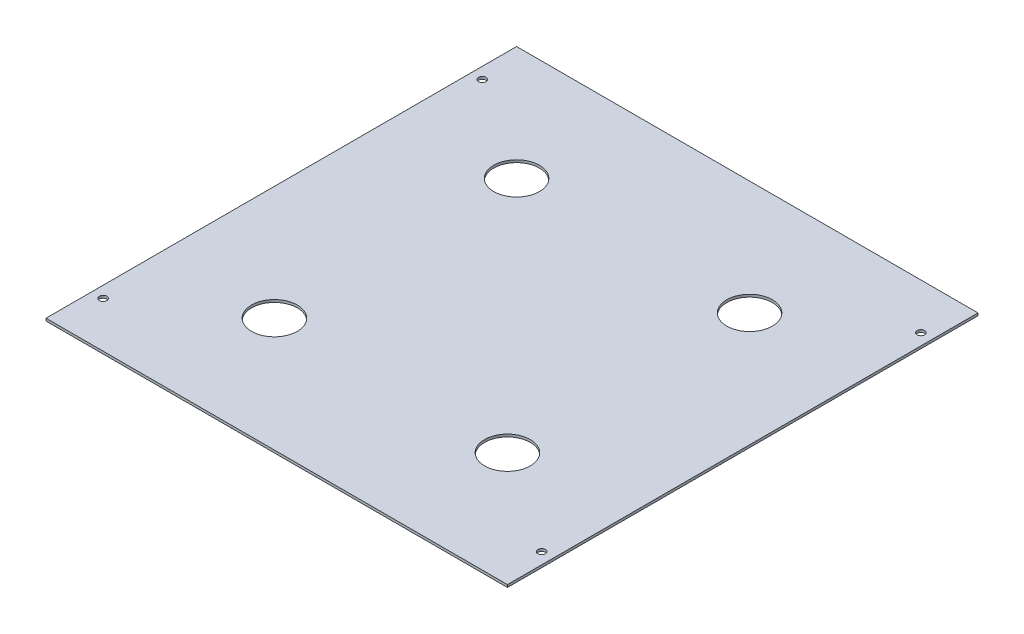
ISO-10303-21;
HEADER;
FILE_DESCRIPTION(('STEP AP214'),'2;1');
FILE_NAME('part.step','',(''),(''),'','','');
FILE_SCHEMA(('AUTOMOTIVE_DESIGN { 1 0 10303 214 1 1 1 1 }'));
ENDSEC;
DATA;
#1=APPLICATION_CONTEXT('core data for automotive mechanical design processes');
#2=APPLICATION_PROTOCOL_DEFINITION('international standard','automotive_design',2000,#1);
#3=PRODUCT_CONTEXT('',#1,'mechanical');
#4=PRODUCT('Part','Part','',(#3));
#5=PRODUCT_RELATED_PRODUCT_CATEGORY('part','',(#4));
#6=PRODUCT_DEFINITION_FORMATION('','',#4);
#7=PRODUCT_DEFINITION_CONTEXT('part definition',#1,'design');
#8=PRODUCT_DEFINITION('design','',#6,#7);
#9=PRODUCT_DEFINITION_SHAPE('','',#8);
#10=(LENGTH_UNIT() NAMED_UNIT(*) SI_UNIT(.MILLI.,.METRE.));
#11=(NAMED_UNIT(*) PLANE_ANGLE_UNIT() SI_UNIT($,.RADIAN.));
#12=(NAMED_UNIT(*) SI_UNIT($,.STERADIAN.) SOLID_ANGLE_UNIT());
#13=UNCERTAINTY_MEASURE_WITH_UNIT(LENGTH_MEASURE(1.E-05),#10,'distance_accuracy_value','');
#14=(GEOMETRIC_REPRESENTATION_CONTEXT(3) GLOBAL_UNCERTAINTY_ASSIGNED_CONTEXT((#13)) GLOBAL_UNIT_ASSIGNED_CONTEXT((#10,
#11,#12)) REPRESENTATION_CONTEXT('',''));
#15=CARTESIAN_POINT('',(0.,0.,0.));
#16=DIRECTION('',(0.,0.,1.));
#17=DIRECTION('',(1.,0.,0.));
#18=AXIS2_PLACEMENT_3D('',#15,#16,#17);
#19=CARTESIAN_POINT('',(0.,1.1,0.));
#20=DIRECTION('',(0.,-1.,0.));
#21=DIRECTION('',(0.,0.,-1.));
#22=AXIS2_PLACEMENT_3D('',#19,#20,#21);
#23=PLANE('',#22);
#24=DIRECTION('',(0.,0.,1.));
#25=VECTOR('',#24,1.);
#26=CARTESIAN_POINT('',(0.,1.1,0.));
#27=LINE('',#26,#25);
#28=CARTESIAN_POINT('',(0.,1.1,-206.));
#29=VERTEX_POINT('',#28);
#30=CARTESIAN_POINT('',(0.,1.1,0.));
#31=VERTEX_POINT('',#30);
#32=EDGE_CURVE('E106',#29,#31,#27,.T.);
#33=ORIENTED_EDGE('',*,*,#32,.T.);
#34=DIRECTION('',(1.,0.,0.));
#35=VECTOR('',#34,1.);
#36=CARTESIAN_POINT('',(0.,1.1,0.));
#37=LINE('',#36,#35);
#38=CARTESIAN_POINT('',(202.,1.1,0.));
#39=VERTEX_POINT('',#38);
#40=EDGE_CURVE('E100',#31,#39,#37,.T.);
#41=ORIENTED_EDGE('',*,*,#40,.T.);
#42=DIRECTION('',(0.,0.,-1.));
#43=VECTOR('',#42,1.);
#44=CARTESIAN_POINT('',(202.,1.1,0.));
#45=LINE('',#44,#43);
#46=CARTESIAN_POINT('',(202.,1.1,-206.));
#47=VERTEX_POINT('',#46);
#48=EDGE_CURVE('E104',#39,#47,#45,.T.);
#49=ORIENTED_EDGE('',*,*,#48,.T.);
#50=DIRECTION('',(-1.,0.,0.));
#51=VECTOR('',#50,1.);
#52=CARTESIAN_POINT('',(0.,1.1,-206.));
#53=LINE('',#52,#51);
#54=EDGE_CURVE('E68',#47,#29,#53,.T.);
#55=ORIENTED_EDGE('',*,*,#54,.T.);
#56=EDGE_LOOP('',(#33,#41,#49,#55));
#57=FACE_BOUND('',#56,.T.);
#58=CARTESIAN_POINT('',(5.,1.1,-186.));
#59=DIRECTION('',(0.,1.,0.));
#60=DIRECTION('',(0.,0.,1.));
#61=AXIS2_PLACEMENT_3D('',#58,#59,#60);
#62=CIRCLE('',#61,1.65000000000001);
#63=CARTESIAN_POINT('',(5.,1.1,-184.35));
#64=VERTEX_POINT('',#63);
#65=EDGE_CURVE('E128',#64,#64,#62,.T.);
#66=ORIENTED_EDGE('',*,*,#65,.F.);
#67=EDGE_LOOP('',(#66));
#68=FACE_BOUND('',#67,.T.);
#69=CARTESIAN_POINT('',(50.,1.1,-156.));
#70=DIRECTION('',(0.,1.,0.));
#71=DIRECTION('',(0.,0.,1.));
#72=AXIS2_PLACEMENT_3D('',#69,#70,#71);
#73=CIRCLE('',#72,10.);
#74=CARTESIAN_POINT('',(50.,1.1,-146.));
#75=VERTEX_POINT('',#74);
#76=EDGE_CURVE('E148',#75,#75,#73,.T.);
#77=ORIENTED_EDGE('',*,*,#76,.F.);
#78=EDGE_LOOP('',(#77));
#79=FACE_BOUND('',#78,.T.);
#80=CARTESIAN_POINT('',(152.,1.1,-156.));
#81=DIRECTION('',(0.,1.,0.));
#82=DIRECTION('',(0.,0.,1.));
#83=AXIS2_PLACEMENT_3D('',#80,#81,#82);
#84=CIRCLE('',#83,10.);
#85=CARTESIAN_POINT('',(152.,1.1,-146.));
#86=VERTEX_POINT('',#85);
#87=EDGE_CURVE('E156',#86,#86,#84,.T.);
#88=ORIENTED_EDGE('',*,*,#87,.F.);
#89=EDGE_LOOP('',(#88));
#90=FACE_BOUND('',#89,.T.);
#91=CARTESIAN_POINT('',(50.,1.1,-50.));
#92=DIRECTION('',(0.,1.,0.));
#93=DIRECTION('',(0.,0.,1.));
#94=AXIS2_PLACEMENT_3D('',#91,#92,#93);
#95=CIRCLE('',#94,10.);
#96=CARTESIAN_POINT('',(50.,1.1,-40.));
#97=VERTEX_POINT('',#96);
#98=EDGE_CURVE('E164',#97,#97,#95,.T.);
#99=ORIENTED_EDGE('',*,*,#98,.F.);
#100=EDGE_LOOP('',(#99));
#101=FACE_BOUND('',#100,.T.);
#102=CARTESIAN_POINT('',(152.,1.1,-50.));
#103=DIRECTION('',(0.,1.,0.));
#104=DIRECTION('',(0.,0.,1.));
#105=AXIS2_PLACEMENT_3D('',#102,#103,#104);
#106=CIRCLE('',#105,10.);
#107=CARTESIAN_POINT('',(152.,1.1,-40.));
#108=VERTEX_POINT('',#107);
#109=EDGE_CURVE('E172',#108,#108,#106,.T.);
#110=ORIENTED_EDGE('',*,*,#109,.F.);
#111=EDGE_LOOP('',(#110));
#112=FACE_BOUND('',#111,.T.);
#113=CARTESIAN_POINT('',(5.,1.1,-20.));
#114=DIRECTION('',(0.,1.,0.));
#115=DIRECTION('',(0.,0.,1.));
#116=AXIS2_PLACEMENT_3D('',#113,#114,#115);
#117=CIRCLE('',#116,1.65);
#118=CARTESIAN_POINT('',(5.,1.1,-18.35));
#119=VERTEX_POINT('',#118);
#120=EDGE_CURVE('E180',#119,#119,#117,.T.);
#121=ORIENTED_EDGE('',*,*,#120,.F.);
#122=EDGE_LOOP('',(#121));
#123=FACE_BOUND('',#122,.T.);
#124=CARTESIAN_POINT('',(197.,1.1,-20.));
#125=DIRECTION('',(0.,1.,0.));
#126=DIRECTION('',(0.,0.,1.));
#127=AXIS2_PLACEMENT_3D('',#124,#125,#126);
#128=CIRCLE('',#127,1.65000000000002);
#129=CARTESIAN_POINT('',(197.,1.1,-18.35));
#130=VERTEX_POINT('',#129);
#131=EDGE_CURVE('E188',#130,#130,#128,.T.);
#132=ORIENTED_EDGE('',*,*,#131,.F.);
#133=EDGE_LOOP('',(#132));
#134=FACE_BOUND('',#133,.T.);
#135=CARTESIAN_POINT('',(197.,1.1,-186.));
#136=DIRECTION('',(0.,1.,0.));
#137=DIRECTION('',(0.,0.,1.));
#138=AXIS2_PLACEMENT_3D('',#135,#136,#137);
#139=CIRCLE('',#138,1.65000000000002);
#140=CARTESIAN_POINT('',(197.,1.1,-184.35));
#141=VERTEX_POINT('',#140);
#142=EDGE_CURVE('E196',#141,#141,#139,.T.);
#143=ORIENTED_EDGE('',*,*,#142,.F.);
#144=EDGE_LOOP('',(#143));
#145=FACE_BOUND('',#144,.T.);
#146=ADVANCED_FACE('F47',(#57,#68,#79,#90,#101,#112,#123,#134,#145),#23,.F.);
#147=CARTESIAN_POINT('',(0.,0.,0.));
#148=DIRECTION('',(0.,-1.,0.));
#149=DIRECTION('',(0.,0.,-1.));
#150=AXIS2_PLACEMENT_3D('',#147,#148,#149);
#151=PLANE('',#150);
#152=CARTESIAN_POINT('',(197.,0.,-20.));
#153=DIRECTION('',(0.,1.,0.));
#154=DIRECTION('',(0.,0.,1.));
#155=AXIS2_PLACEMENT_3D('',#152,#153,#154);
#156=CIRCLE('',#155,1.65000000000002);
#157=CARTESIAN_POINT('',(197.,0.,-18.35));
#158=VERTEX_POINT('',#157);
#159=EDGE_CURVE('E192',#158,#158,#156,.T.);
#160=ORIENTED_EDGE('',*,*,#159,.T.);
#161=EDGE_LOOP('',(#160));
#162=FACE_BOUND('',#161,.T.);
#163=CARTESIAN_POINT('',(152.,0.,-50.));
#164=DIRECTION('',(0.,1.,0.));
#165=DIRECTION('',(0.,0.,1.));
#166=AXIS2_PLACEMENT_3D('',#163,#164,#165);
#167=CIRCLE('',#166,10.);
#168=CARTESIAN_POINT('',(152.,0.,-40.));
#169=VERTEX_POINT('',#168);
#170=EDGE_CURVE('E176',#169,#169,#167,.T.);
#171=ORIENTED_EDGE('',*,*,#170,.T.);
#172=EDGE_LOOP('',(#171));
#173=FACE_BOUND('',#172,.T.);
#174=CARTESIAN_POINT('',(152.,0.,-156.));
#175=DIRECTION('',(0.,1.,0.));
#176=DIRECTION('',(0.,0.,1.));
#177=AXIS2_PLACEMENT_3D('',#174,#175,#176);
#178=CIRCLE('',#177,10.);
#179=CARTESIAN_POINT('',(152.,0.,-146.));
#180=VERTEX_POINT('',#179);
#181=EDGE_CURVE('E160',#180,#180,#178,.T.);
#182=ORIENTED_EDGE('',*,*,#181,.T.);
#183=EDGE_LOOP('',(#182));
#184=FACE_BOUND('',#183,.T.);
#185=CARTESIAN_POINT('',(5.,0.,-186.));
#186=DIRECTION('',(0.,1.,0.));
#187=DIRECTION('',(0.,0.,1.));
#188=AXIS2_PLACEMENT_3D('',#185,#186,#187);
#189=CIRCLE('',#188,1.65000000000001);
#190=CARTESIAN_POINT('',(5.,0.,-184.35));
#191=VERTEX_POINT('',#190);
#192=EDGE_CURVE('E145',#191,#191,#189,.T.);
#193=ORIENTED_EDGE('',*,*,#192,.T.);
#194=EDGE_LOOP('',(#193));
#195=FACE_BOUND('',#194,.T.);
#196=DIRECTION('',(0.,0.,1.));
#197=VECTOR('',#196,1.);
#198=CARTESIAN_POINT('',(0.,0.,0.));
#199=LINE('',#198,#197);
#200=CARTESIAN_POINT('',(0.,0.,-206.));
#201=VERTEX_POINT('',#200);
#202=CARTESIAN_POINT('',(0.,0.,0.));
#203=VERTEX_POINT('',#202);
#204=EDGE_CURVE('E124',#201,#203,#199,.T.);
#205=ORIENTED_EDGE('',*,*,#204,.F.);
#206=DIRECTION('',(-1.,0.,0.));
#207=VECTOR('',#206,1.);
#208=CARTESIAN_POINT('',(0.,0.,-206.));
#209=LINE('',#208,#207);
#210=CARTESIAN_POINT('',(202.,0.,-206.));
#211=VERTEX_POINT('',#210);
#212=EDGE_CURVE('E93',#211,#201,#209,.T.);
#213=ORIENTED_EDGE('',*,*,#212,.F.);
#214=DIRECTION('',(0.,0.,-1.));
#215=VECTOR('',#214,1.);
#216=CARTESIAN_POINT('',(202.,0.,0.));
#217=LINE('',#216,#215);
#218=CARTESIAN_POINT('',(202.,0.,0.));
#219=VERTEX_POINT('',#218);
#220=EDGE_CURVE('E87',#219,#211,#217,.T.);
#221=ORIENTED_EDGE('',*,*,#220,.F.);
#222=DIRECTION('',(1.,0.,0.));
#223=VECTOR('',#222,1.);
#224=CARTESIAN_POINT('',(0.,0.,0.));
#225=LINE('',#224,#223);
#226=EDGE_CURVE('E111',#203,#219,#225,.T.);
#227=ORIENTED_EDGE('',*,*,#226,.F.);
#228=EDGE_LOOP('',(#205,#213,#221,#227));
#229=FACE_BOUND('',#228,.T.);
#230=CARTESIAN_POINT('',(50.,0.,-156.));
#231=DIRECTION('',(0.,1.,0.));
#232=DIRECTION('',(0.,0.,1.));
#233=AXIS2_PLACEMENT_3D('',#230,#231,#232);
#234=CIRCLE('',#233,10.);
#235=CARTESIAN_POINT('',(50.,0.,-146.));
#236=VERTEX_POINT('',#235);
#237=EDGE_CURVE('E152',#236,#236,#234,.T.);
#238=ORIENTED_EDGE('',*,*,#237,.T.);
#239=EDGE_LOOP('',(#238));
#240=FACE_BOUND('',#239,.T.);
#241=CARTESIAN_POINT('',(50.,0.,-50.));
#242=DIRECTION('',(0.,1.,0.));
#243=DIRECTION('',(0.,0.,1.));
#244=AXIS2_PLACEMENT_3D('',#241,#242,#243);
#245=CIRCLE('',#244,10.);
#246=CARTESIAN_POINT('',(50.,0.,-40.));
#247=VERTEX_POINT('',#246);
#248=EDGE_CURVE('E168',#247,#247,#245,.T.);
#249=ORIENTED_EDGE('',*,*,#248,.T.);
#250=EDGE_LOOP('',(#249));
#251=FACE_BOUND('',#250,.T.);
#252=CARTESIAN_POINT('',(5.,0.,-20.));
#253=DIRECTION('',(0.,1.,0.));
#254=DIRECTION('',(0.,0.,1.));
#255=AXIS2_PLACEMENT_3D('',#252,#253,#254);
#256=CIRCLE('',#255,1.65);
#257=CARTESIAN_POINT('',(5.,0.,-18.35));
#258=VERTEX_POINT('',#257);
#259=EDGE_CURVE('E184',#258,#258,#256,.T.);
#260=ORIENTED_EDGE('',*,*,#259,.T.);
#261=EDGE_LOOP('',(#260));
#262=FACE_BOUND('',#261,.T.);
#263=CARTESIAN_POINT('',(197.,0.,-186.));
#264=DIRECTION('',(0.,1.,0.));
#265=DIRECTION('',(0.,0.,1.));
#266=AXIS2_PLACEMENT_3D('',#263,#264,#265);
#267=CIRCLE('',#266,1.65000000000002);
#268=CARTESIAN_POINT('',(197.,0.,-184.35));
#269=VERTEX_POINT('',#268);
#270=EDGE_CURVE('E200',#269,#269,#267,.T.);
#271=ORIENTED_EDGE('',*,*,#270,.T.);
#272=EDGE_LOOP('',(#271));
#273=FACE_BOUND('',#272,.T.);
#274=ADVANCED_FACE('F139',(#162,#173,#184,#195,#229,#240,#251,#262,#273),#151,.T.);
#275=CARTESIAN_POINT('',(0.,1.1,0.));
#276=DIRECTION('',(1.,0.,0.));
#277=DIRECTION('',(0.,0.,-1.));
#278=AXIS2_PLACEMENT_3D('',#275,#276,#277);
#279=PLANE('',#278);
#280=ORIENTED_EDGE('',*,*,#204,.T.);
#281=DIRECTION('',(0.,-1.,0.));
#282=VECTOR('',#281,1.);
#283=CARTESIAN_POINT('',(0.,1.1,0.));
#284=LINE('',#283,#282);
#285=EDGE_CURVE('E11',#31,#203,#284,.T.);
#286=ORIENTED_EDGE('',*,*,#285,.F.);
#287=ORIENTED_EDGE('',*,*,#32,.F.);
#288=DIRECTION('',(0.,-1.,0.));
#289=VECTOR('',#288,1.);
#290=CARTESIAN_POINT('',(0.,1.1,-206.));
#291=LINE('',#290,#289);
#292=EDGE_CURVE('E120',#29,#201,#291,.T.);
#293=ORIENTED_EDGE('',*,*,#292,.T.);
#294=EDGE_LOOP('',(#280,#286,#287,#293));
#295=FACE_BOUND('',#294,.T.);
#296=ADVANCED_FACE('F49',(#295),#279,.F.);
#297=CARTESIAN_POINT('',(0.,1.1,0.));
#298=DIRECTION('',(0.,0.,-1.));
#299=DIRECTION('',(-1.,0.,0.));
#300=AXIS2_PLACEMENT_3D('',#297,#298,#299);
#301=PLANE('',#300);
#302=ORIENTED_EDGE('',*,*,#226,.T.);
#303=DIRECTION('',(0.,-1.,0.));
#304=VECTOR('',#303,1.);
#305=CARTESIAN_POINT('',(202.,1.1,0.));
#306=LINE('',#305,#304);
#307=EDGE_CURVE('E57',#39,#219,#306,.T.);
#308=ORIENTED_EDGE('',*,*,#307,.F.);
#309=ORIENTED_EDGE('',*,*,#40,.F.);
#310=ORIENTED_EDGE('',*,*,#285,.T.);
#311=EDGE_LOOP('',(#302,#308,#309,#310));
#312=FACE_BOUND('',#311,.T.);
#313=ADVANCED_FACE('F110',(#312),#301,.F.);
#314=CARTESIAN_POINT('',(202.,1.1,0.));
#315=DIRECTION('',(-1.,0.,0.));
#316=DIRECTION('',(0.,0.,1.));
#317=AXIS2_PLACEMENT_3D('',#314,#315,#316);
#318=PLANE('',#317);
#319=ORIENTED_EDGE('',*,*,#220,.T.);
#320=DIRECTION('',(0.,-1.,0.));
#321=VECTOR('',#320,1.);
#322=CARTESIAN_POINT('',(202.,1.1,-206.));
#323=LINE('',#322,#321);
#324=EDGE_CURVE('E113',#47,#211,#323,.T.);
#325=ORIENTED_EDGE('',*,*,#324,.F.);
#326=ORIENTED_EDGE('',*,*,#48,.F.);
#327=ORIENTED_EDGE('',*,*,#307,.T.);
#328=EDGE_LOOP('',(#319,#325,#326,#327));
#329=FACE_BOUND('',#328,.T.);
#330=ADVANCED_FACE('F114',(#329),#318,.F.);
#331=CARTESIAN_POINT('',(0.,1.1,-206.));
#332=DIRECTION('',(0.,0.,1.));
#333=DIRECTION('',(1.,0.,0.));
#334=AXIS2_PLACEMENT_3D('',#331,#332,#333);
#335=PLANE('',#334);
#336=ORIENTED_EDGE('',*,*,#212,.T.);
#337=ORIENTED_EDGE('',*,*,#292,.F.);
#338=ORIENTED_EDGE('',*,*,#54,.F.);
#339=ORIENTED_EDGE('',*,*,#324,.T.);
#340=EDGE_LOOP('',(#336,#337,#338,#339));
#341=FACE_BOUND('',#340,.T.);
#342=ADVANCED_FACE('F136',(#341),#335,.F.);
#343=CARTESIAN_POINT('',(5.,1.1,-186.));
#344=DIRECTION('',(0.,-1.,0.));
#345=DIRECTION('',(0.,0.,-1.));
#346=AXIS2_PLACEMENT_3D('',#343,#344,#345);
#347=CYLINDRICAL_SURFACE('',#346,1.65000000000001);
#348=ORIENTED_EDGE('',*,*,#65,.T.);
#349=EDGE_LOOP('',(#348));
#350=FACE_BOUND('',#349,.T.);
#351=ORIENTED_EDGE('',*,*,#192,.F.);
#352=EDGE_LOOP('',(#351));
#353=FACE_BOUND('',#352,.T.);
#354=ADVANCED_FACE('F219',(#350,#353),#347,.F.);
#355=CARTESIAN_POINT('',(50.,1.1,-156.));
#356=DIRECTION('',(0.,-1.,0.));
#357=DIRECTION('',(0.,0.,-1.));
#358=AXIS2_PLACEMENT_3D('',#355,#356,#357);
#359=CYLINDRICAL_SURFACE('',#358,10.);
#360=ORIENTED_EDGE('',*,*,#76,.T.);
#361=EDGE_LOOP('',(#360));
#362=FACE_BOUND('',#361,.T.);
#363=ORIENTED_EDGE('',*,*,#237,.F.);
#364=EDGE_LOOP('',(#363));
#365=FACE_BOUND('',#364,.T.);
#366=ADVANCED_FACE('F255',(#362,#365),#359,.F.);
#367=CARTESIAN_POINT('',(152.,1.1,-156.));
#368=DIRECTION('',(0.,-1.,0.));
#369=DIRECTION('',(0.,0.,-1.));
#370=AXIS2_PLACEMENT_3D('',#367,#368,#369);
#371=CYLINDRICAL_SURFACE('',#370,10.);
#372=ORIENTED_EDGE('',*,*,#87,.T.);
#373=EDGE_LOOP('',(#372));
#374=FACE_BOUND('',#373,.T.);
#375=ORIENTED_EDGE('',*,*,#181,.F.);
#376=EDGE_LOOP('',(#375));
#377=FACE_BOUND('',#376,.T.);
#378=ADVANCED_FACE('F263',(#374,#377),#371,.F.);
#379=CARTESIAN_POINT('',(50.,1.1,-50.));
#380=DIRECTION('',(0.,-1.,0.));
#381=DIRECTION('',(0.,0.,-1.));
#382=AXIS2_PLACEMENT_3D('',#379,#380,#381);
#383=CYLINDRICAL_SURFACE('',#382,10.);
#384=ORIENTED_EDGE('',*,*,#98,.T.);
#385=EDGE_LOOP('',(#384));
#386=FACE_BOUND('',#385,.T.);
#387=ORIENTED_EDGE('',*,*,#248,.F.);
#388=EDGE_LOOP('',(#387));
#389=FACE_BOUND('',#388,.T.);
#390=ADVANCED_FACE('F271',(#386,#389),#383,.F.);
#391=CARTESIAN_POINT('',(152.,1.1,-50.));
#392=DIRECTION('',(0.,-1.,0.));
#393=DIRECTION('',(0.,0.,-1.));
#394=AXIS2_PLACEMENT_3D('',#391,#392,#393);
#395=CYLINDRICAL_SURFACE('',#394,10.);
#396=ORIENTED_EDGE('',*,*,#109,.T.);
#397=EDGE_LOOP('',(#396));
#398=FACE_BOUND('',#397,.T.);
#399=ORIENTED_EDGE('',*,*,#170,.F.);
#400=EDGE_LOOP('',(#399));
#401=FACE_BOUND('',#400,.T.);
#402=ADVANCED_FACE('F280',(#398,#401),#395,.F.);
#403=CARTESIAN_POINT('',(5.,1.1,-20.));
#404=DIRECTION('',(0.,-1.,0.));
#405=DIRECTION('',(0.,0.,-1.));
#406=AXIS2_PLACEMENT_3D('',#403,#404,#405);
#407=CYLINDRICAL_SURFACE('',#406,1.65);
#408=ORIENTED_EDGE('',*,*,#120,.T.);
#409=EDGE_LOOP('',(#408));
#410=FACE_BOUND('',#409,.T.);
#411=ORIENTED_EDGE('',*,*,#259,.F.);
#412=EDGE_LOOP('',(#411));
#413=FACE_BOUND('',#412,.T.);
#414=ADVANCED_FACE('F289',(#410,#413),#407,.F.);
#415=CARTESIAN_POINT('',(197.,1.1,-20.));
#416=DIRECTION('',(0.,-1.,0.));
#417=DIRECTION('',(0.,0.,-1.));
#418=AXIS2_PLACEMENT_3D('',#415,#416,#417);
#419=CYLINDRICAL_SURFACE('',#418,1.65000000000002);
#420=ORIENTED_EDGE('',*,*,#131,.T.);
#421=EDGE_LOOP('',(#420));
#422=FACE_BOUND('',#421,.T.);
#423=ORIENTED_EDGE('',*,*,#159,.F.);
#424=EDGE_LOOP('',(#423));
#425=FACE_BOUND('',#424,.T.);
#426=ADVANCED_FACE('F298',(#422,#425),#419,.F.);
#427=CARTESIAN_POINT('',(197.,1.1,-186.));
#428=DIRECTION('',(0.,-1.,0.));
#429=DIRECTION('',(0.,0.,-1.));
#430=AXIS2_PLACEMENT_3D('',#427,#428,#429);
#431=CYLINDRICAL_SURFACE('',#430,1.65000000000002);
#432=ORIENTED_EDGE('',*,*,#142,.T.);
#433=EDGE_LOOP('',(#432));
#434=FACE_BOUND('',#433,.T.);
#435=ORIENTED_EDGE('',*,*,#270,.F.);
#436=EDGE_LOOP('',(#435));
#437=FACE_BOUND('',#436,.T.);
#438=ADVANCED_FACE('F208',(#434,#437),#431,.F.);
#439=CLOSED_SHELL('',(#146,#274,#296,#313,#330,#342,#354,#366,#378,#390,#402,#414,#426,#438));
#440=MANIFOLD_SOLID_BREP('B2',#439);
#441=ADVANCED_BREP_SHAPE_REPRESENTATION('',(#18,#440),#14);
#442=SHAPE_DEFINITION_REPRESENTATION(#9,#441);
ENDSEC;
END-ISO-10303-21;
